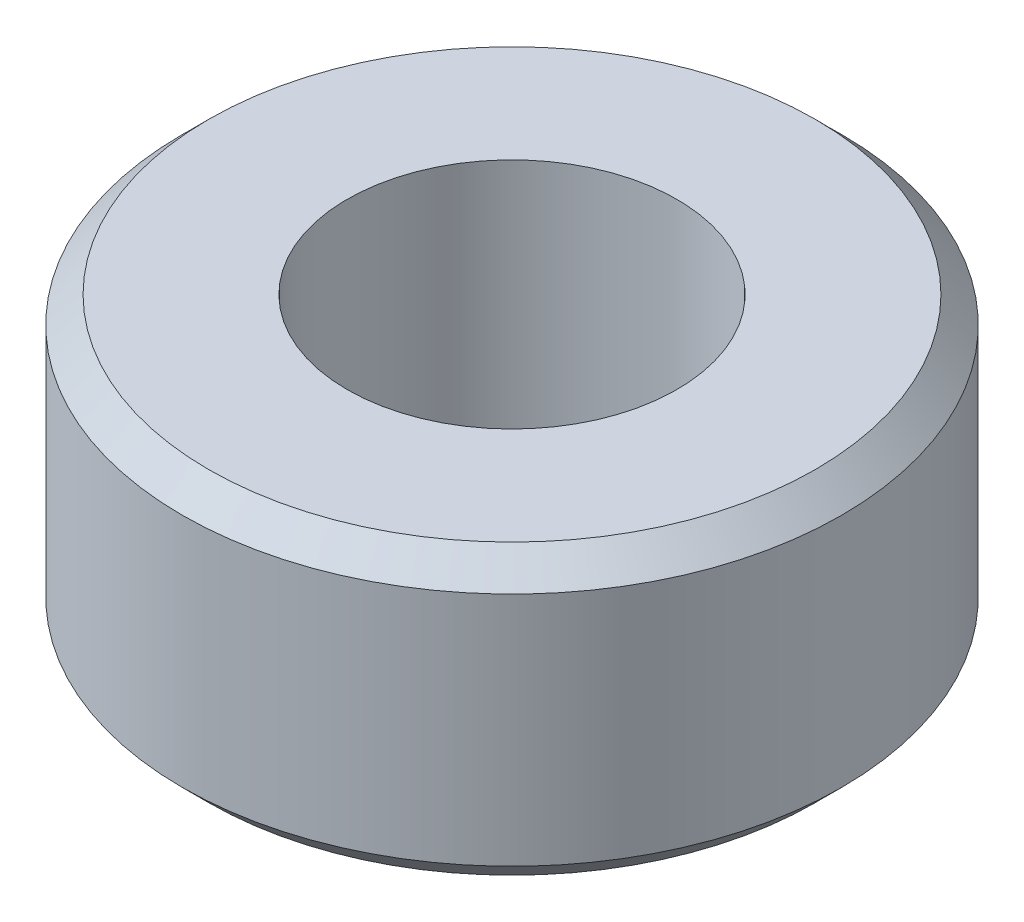
ISO-10303-21;
HEADER;
FILE_DESCRIPTION(('STEP AP214'),'2;1');
FILE_NAME('part.step','',(''),(''),'','','');
FILE_SCHEMA(('AUTOMOTIVE_DESIGN { 1 0 10303 214 1 1 1 1 }'));
ENDSEC;
DATA;
#1=APPLICATION_CONTEXT('core data for automotive mechanical design processes');
#2=APPLICATION_PROTOCOL_DEFINITION('international standard','automotive_design',2000,#1);
#3=PRODUCT_CONTEXT('',#1,'mechanical');
#4=PRODUCT('Part','Part','',(#3));
#5=PRODUCT_RELATED_PRODUCT_CATEGORY('part','',(#4));
#6=PRODUCT_DEFINITION_FORMATION('','',#4);
#7=PRODUCT_DEFINITION_CONTEXT('part definition',#1,'design');
#8=PRODUCT_DEFINITION('design','',#6,#7);
#9=PRODUCT_DEFINITION_SHAPE('','',#8);
#10=(LENGTH_UNIT() NAMED_UNIT(*) SI_UNIT(.MILLI.,.METRE.));
#11=(NAMED_UNIT(*) PLANE_ANGLE_UNIT() SI_UNIT($,.RADIAN.));
#12=(NAMED_UNIT(*) SI_UNIT($,.STERADIAN.) SOLID_ANGLE_UNIT());
#13=UNCERTAINTY_MEASURE_WITH_UNIT(LENGTH_MEASURE(1.E-05),#10,'distance_accuracy_value','');
#14=(GEOMETRIC_REPRESENTATION_CONTEXT(3) GLOBAL_UNCERTAINTY_ASSIGNED_CONTEXT((#13)) GLOBAL_UNIT_ASSIGNED_CONTEXT((#10,
#11,#12)) REPRESENTATION_CONTEXT('',''));
#15=CARTESIAN_POINT('',(0.,0.,0.));
#16=DIRECTION('',(0.,0.,1.));
#17=DIRECTION('',(1.,0.,0.));
#18=AXIS2_PLACEMENT_3D('',#15,#16,#17);
#19=CARTESIAN_POINT('',(0.,2.778125,0.));
#20=DIRECTION('',(0.,1.,0.));
#21=DIRECTION('',(0.,0.,1.));
#22=AXIS2_PLACEMENT_3D('',#19,#20,#21);
#23=PLANE('',#22);
#24=CARTESIAN_POINT('',(0.,2.778125,0.));
#25=DIRECTION('',(0.,1.,0.));
#26=DIRECTION('',(0.,0.,1.));
#27=AXIS2_PLACEMENT_3D('',#24,#25,#26);
#28=CIRCLE('',#27,2.921);
#29=CARTESIAN_POINT('',(0.,2.778125,2.921));
#30=VERTEX_POINT('',#29);
#31=EDGE_CURVE('E10',#30,#30,#28,.T.);
#32=ORIENTED_EDGE('',*,*,#31,.T.);
#33=EDGE_LOOP('',(#32));
#34=FACE_BOUND('',#33,.T.);
#35=CARTESIAN_POINT('',(0.,2.778125,0.));
#36=DIRECTION('',(0.,1.,0.));
#37=DIRECTION('',(0.,0.,1.));
#38=AXIS2_PLACEMENT_3D('',#35,#36,#37);
#39=CIRCLE('',#38,1.5875);
#40=CARTESIAN_POINT('',(0.,2.778125,1.5875));
#41=VERTEX_POINT('',#40);
#42=EDGE_CURVE('E51',#41,#41,#39,.T.);
#43=ORIENTED_EDGE('',*,*,#42,.F.);
#44=EDGE_LOOP('',(#43));
#45=FACE_BOUND('',#44,.T.);
#46=ADVANCED_FACE('F31',(#34,#45),#23,.T.);
#47=CARTESIAN_POINT('',(0.,0.,0.));
#48=DIRECTION('',(0.,1.,0.));
#49=DIRECTION('',(0.,0.,1.));
#50=AXIS2_PLACEMENT_3D('',#47,#48,#49);
#51=PLANE('',#50);
#52=CARTESIAN_POINT('',(0.,0.,0.));
#53=DIRECTION('',(0.,1.,0.));
#54=DIRECTION('',(0.,0.,1.));
#55=AXIS2_PLACEMENT_3D('',#52,#53,#54);
#56=CIRCLE('',#55,2.921);
#57=CARTESIAN_POINT('',(0.,0.,2.921));
#58=VERTEX_POINT('',#57);
#59=EDGE_CURVE('E38',#58,#58,#56,.F.);
#60=ORIENTED_EDGE('',*,*,#59,.T.);
#61=EDGE_LOOP('',(#60));
#62=FACE_BOUND('',#61,.T.);
#63=CARTESIAN_POINT('',(0.,0.,0.));
#64=DIRECTION('',(0.,1.,0.));
#65=DIRECTION('',(0.,0.,1.));
#66=AXIS2_PLACEMENT_3D('',#63,#64,#65);
#67=CIRCLE('',#66,1.5875);
#68=CARTESIAN_POINT('',(0.,0.,1.5875));
#69=VERTEX_POINT('',#68);
#70=EDGE_CURVE('E52',#69,#69,#67,.T.);
#71=ORIENTED_EDGE('',*,*,#70,.T.);
#72=EDGE_LOOP('',(#71));
#73=FACE_BOUND('',#72,.T.);
#74=ADVANCED_FACE('F62',(#62,#73),#51,.F.);
#75=CARTESIAN_POINT('',(0.,2.778125,0.));
#76=DIRECTION('',(0.,-1.,0.));
#77=DIRECTION('',(0.,0.,-1.));
#78=AXIS2_PLACEMENT_3D('',#75,#76,#77);
#79=CYLINDRICAL_SURFACE('',#78,3.175);
#80=CARTESIAN_POINT('',(0.,0.254,0.));
#81=DIRECTION('',(0.,1.,0.));
#82=DIRECTION('',(0.,0.,1.));
#83=AXIS2_PLACEMENT_3D('',#80,#81,#82);
#84=CIRCLE('',#83,3.175);
#85=CARTESIAN_POINT('',(0.,0.254,3.175));
#86=VERTEX_POINT('',#85);
#87=EDGE_CURVE('E42',#86,#86,#84,.T.);
#88=ORIENTED_EDGE('',*,*,#87,.T.);
#89=EDGE_LOOP('',(#88));
#90=FACE_BOUND('',#89,.T.);
#91=CARTESIAN_POINT('',(0.,2.524125,0.));
#92=DIRECTION('',(0.,1.,0.));
#93=DIRECTION('',(0.,0.,1.));
#94=AXIS2_PLACEMENT_3D('',#91,#92,#93);
#95=CIRCLE('',#94,3.175);
#96=CARTESIAN_POINT('',(0.,2.524125,3.175));
#97=VERTEX_POINT('',#96);
#98=EDGE_CURVE('E46',#97,#97,#95,.F.);
#99=ORIENTED_EDGE('',*,*,#98,.T.);
#100=EDGE_LOOP('',(#99));
#101=FACE_BOUND('',#100,.T.);
#102=ADVANCED_FACE('F67',(#90,#101),#79,.T.);
#103=CARTESIAN_POINT('',(0.,2.778125,0.));
#104=DIRECTION('',(0.,-1.,0.));
#105=DIRECTION('',(0.,0.,-1.));
#106=AXIS2_PLACEMENT_3D('',#103,#104,#105);
#107=CYLINDRICAL_SURFACE('',#106,1.5875);
#108=ORIENTED_EDGE('',*,*,#42,.T.);
#109=EDGE_LOOP('',(#108));
#110=FACE_BOUND('',#109,.T.);
#111=ORIENTED_EDGE('',*,*,#70,.F.);
#112=EDGE_LOOP('',(#111));
#113=FACE_BOUND('',#112,.T.);
#114=ADVANCED_FACE('F58',(#110,#113),#107,.F.);
#115=CARTESIAN_POINT('',(0.,0.254,0.));
#116=DIRECTION('',(0.,1.,0.));
#117=DIRECTION('',(0.,0.,1.));
#118=AXIS2_PLACEMENT_3D('',#115,#116,#117);
#119=CONICAL_SURFACE('',#118,3.175,0.78539816339745);
#120=ORIENTED_EDGE('',*,*,#59,.F.);
#121=EDGE_LOOP('',(#120));
#122=FACE_BOUND('',#121,.T.);
#123=ORIENTED_EDGE('',*,*,#87,.F.);
#124=EDGE_LOOP('',(#123));
#125=FACE_BOUND('',#124,.T.);
#126=ADVANCED_FACE('F73',(#122,#125),#119,.T.);
#127=CARTESIAN_POINT('',(0.,2.778125,0.));
#128=DIRECTION('',(0.,-1.,0.));
#129=DIRECTION('',(0.,0.,-1.));
#130=AXIS2_PLACEMENT_3D('',#127,#128,#129);
#131=CONICAL_SURFACE('',#130,2.921,0.785398163397448);
#132=ORIENTED_EDGE('',*,*,#98,.F.);
#133=EDGE_LOOP('',(#132));
#134=FACE_BOUND('',#133,.T.);
#135=ORIENTED_EDGE('',*,*,#31,.F.);
#136=EDGE_LOOP('',(#135));
#137=FACE_BOUND('',#136,.T.);
#138=ADVANCED_FACE('F33',(#134,#137),#131,.T.);
#139=CLOSED_SHELL('',(#46,#74,#102,#114,#126,#138));
#140=MANIFOLD_SOLID_BREP('B2',#139);
#141=ADVANCED_BREP_SHAPE_REPRESENTATION('',(#18,#140),#14);
#142=SHAPE_DEFINITION_REPRESENTATION(#9,#141);
ENDSEC;
END-ISO-10303-21;
